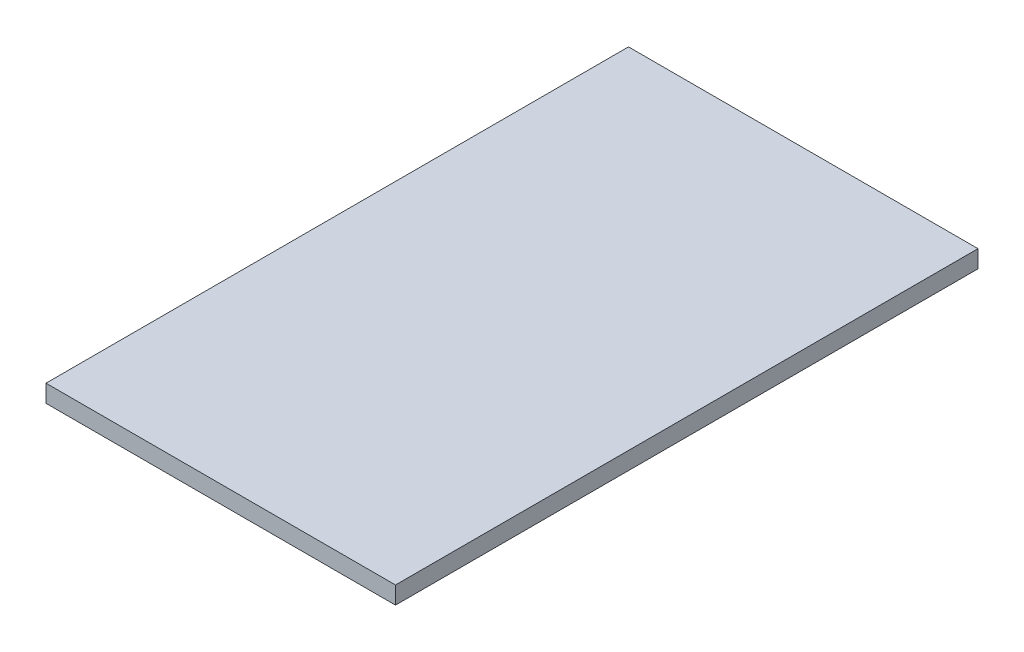
ISO-10303-21;
HEADER;
FILE_DESCRIPTION(('STEP AP214'),'2;1');
FILE_NAME('part.step','',(''),(''),'','','');
FILE_SCHEMA(('AUTOMOTIVE_DESIGN { 1 0 10303 214 1 1 1 1 }'));
ENDSEC;
DATA;
#1=APPLICATION_CONTEXT('core data for automotive mechanical design processes');
#2=APPLICATION_PROTOCOL_DEFINITION('international standard','automotive_design',2000,#1);
#3=PRODUCT_CONTEXT('',#1,'mechanical');
#4=PRODUCT('Part','Part','',(#3));
#5=PRODUCT_RELATED_PRODUCT_CATEGORY('part','',(#4));
#6=PRODUCT_DEFINITION_FORMATION('','',#4);
#7=PRODUCT_DEFINITION_CONTEXT('part definition',#1,'design');
#8=PRODUCT_DEFINITION('design','',#6,#7);
#9=PRODUCT_DEFINITION_SHAPE('','',#8);
#10=(LENGTH_UNIT() NAMED_UNIT(*) SI_UNIT(.MILLI.,.METRE.));
#11=(NAMED_UNIT(*) PLANE_ANGLE_UNIT() SI_UNIT($,.RADIAN.));
#12=(NAMED_UNIT(*) SI_UNIT($,.STERADIAN.) SOLID_ANGLE_UNIT());
#13=UNCERTAINTY_MEASURE_WITH_UNIT(LENGTH_MEASURE(1.E-05),#10,'distance_accuracy_value','');
#14=(GEOMETRIC_REPRESENTATION_CONTEXT(3) GLOBAL_UNCERTAINTY_ASSIGNED_CONTEXT((#13)) GLOBAL_UNIT_ASSIGNED_CONTEXT((#10,
#11,#12)) REPRESENTATION_CONTEXT('',''));
#15=CARTESIAN_POINT('',(0.,0.,0.));
#16=DIRECTION('',(0.,0.,1.));
#17=DIRECTION('',(1.,0.,0.));
#18=AXIS2_PLACEMENT_3D('',#15,#16,#17);
#19=CARTESIAN_POINT('',(300.,30.,-500.));
#20=DIRECTION('',(-1.,0.,0.));
#21=DIRECTION('',(0.,0.,1.));
#22=AXIS2_PLACEMENT_3D('',#19,#20,#21);
#23=PLANE('',#22);
#24=DIRECTION('',(0.,0.,-1.));
#25=VECTOR('',#24,1.);
#26=CARTESIAN_POINT('',(300.,0.,-500.));
#27=LINE('',#26,#25);
#28=CARTESIAN_POINT('',(300.,0.,500.));
#29=VERTEX_POINT('',#28);
#30=CARTESIAN_POINT('',(300.,0.,-500.));
#31=VERTEX_POINT('',#30);
#32=EDGE_CURVE('E107',#29,#31,#27,.T.);
#33=ORIENTED_EDGE('',*,*,#32,.T.);
#34=DIRECTION('',(0.,-1.,0.));
#35=VECTOR('',#34,1.);
#36=CARTESIAN_POINT('',(300.,30.,-500.));
#37=LINE('',#36,#35);
#38=CARTESIAN_POINT('',(300.,30.,-500.));
#39=VERTEX_POINT('',#38);
#40=EDGE_CURVE('E49',#39,#31,#37,.T.);
#41=ORIENTED_EDGE('',*,*,#40,.F.);
#42=DIRECTION('',(0.,0.,-1.));
#43=VECTOR('',#42,1.);
#44=CARTESIAN_POINT('',(300.,30.,-500.));
#45=LINE('',#44,#43);
#46=CARTESIAN_POINT('',(300.,30.,500.));
#47=VERTEX_POINT('',#46);
#48=EDGE_CURVE('E93',#47,#39,#45,.T.);
#49=ORIENTED_EDGE('',*,*,#48,.F.);
#50=DIRECTION('',(0.,-1.,0.));
#51=VECTOR('',#50,1.);
#52=CARTESIAN_POINT('',(300.,30.,500.));
#53=LINE('',#52,#51);
#54=EDGE_CURVE('E103',#47,#29,#53,.T.);
#55=ORIENTED_EDGE('',*,*,#54,.T.);
#56=EDGE_LOOP('',(#33,#41,#49,#55));
#57=FACE_BOUND('',#56,.T.);
#58=ADVANCED_FACE('F41',(#57),#23,.F.);
#59=CARTESIAN_POINT('',(-300.,30.,-500.));
#60=DIRECTION('',(0.,0.,1.));
#61=DIRECTION('',(1.,0.,0.));
#62=AXIS2_PLACEMENT_3D('',#59,#60,#61);
#63=PLANE('',#62);
#64=DIRECTION('',(-1.,0.,0.));
#65=VECTOR('',#64,1.);
#66=CARTESIAN_POINT('',(-300.,0.,-500.));
#67=LINE('',#66,#65);
#68=CARTESIAN_POINT('',(-300.,0.,-500.));
#69=VERTEX_POINT('',#68);
#70=EDGE_CURVE('E98',#31,#69,#67,.T.);
#71=ORIENTED_EDGE('',*,*,#70,.T.);
#72=DIRECTION('',(0.,-1.,0.));
#73=VECTOR('',#72,1.);
#74=CARTESIAN_POINT('',(-300.,30.,-500.));
#75=LINE('',#74,#73);
#76=CARTESIAN_POINT('',(-300.,30.,-500.));
#77=VERTEX_POINT('',#76);
#78=EDGE_CURVE('E96',#77,#69,#75,.T.);
#79=ORIENTED_EDGE('',*,*,#78,.F.);
#80=DIRECTION('',(-1.,0.,0.));
#81=VECTOR('',#80,1.);
#82=CARTESIAN_POINT('',(-300.,30.,-500.));
#83=LINE('',#82,#81);
#84=EDGE_CURVE('E88',#39,#77,#83,.T.);
#85=ORIENTED_EDGE('',*,*,#84,.F.);
#86=ORIENTED_EDGE('',*,*,#40,.T.);
#87=EDGE_LOOP('',(#71,#79,#85,#86));
#88=FACE_BOUND('',#87,.T.);
#89=ADVANCED_FACE('F97',(#88),#63,.F.);
#90=CARTESIAN_POINT('',(-300.,30.,-500.));
#91=DIRECTION('',(1.,0.,0.));
#92=DIRECTION('',(0.,0.,-1.));
#93=AXIS2_PLACEMENT_3D('',#90,#91,#92);
#94=PLANE('',#93);
#95=DIRECTION('',(0.,0.,1.));
#96=VECTOR('',#95,1.);
#97=CARTESIAN_POINT('',(-300.,0.,-500.));
#98=LINE('',#97,#96);
#99=CARTESIAN_POINT('',(-300.,0.,500.));
#100=VERTEX_POINT('',#99);
#101=EDGE_CURVE('E74',#69,#100,#98,.T.);
#102=ORIENTED_EDGE('',*,*,#101,.T.);
#103=DIRECTION('',(0.,-1.,0.));
#104=VECTOR('',#103,1.);
#105=CARTESIAN_POINT('',(-300.,30.,500.));
#106=LINE('',#105,#104);
#107=CARTESIAN_POINT('',(-300.,30.,500.));
#108=VERTEX_POINT('',#107);
#109=EDGE_CURVE('E99',#108,#100,#106,.T.);
#110=ORIENTED_EDGE('',*,*,#109,.F.);
#111=DIRECTION('',(0.,0.,1.));
#112=VECTOR('',#111,1.);
#113=CARTESIAN_POINT('',(-300.,30.,-500.));
#114=LINE('',#113,#112);
#115=EDGE_CURVE('E91',#77,#108,#114,.T.);
#116=ORIENTED_EDGE('',*,*,#115,.F.);
#117=ORIENTED_EDGE('',*,*,#78,.T.);
#118=EDGE_LOOP('',(#102,#110,#116,#117));
#119=FACE_BOUND('',#118,.T.);
#120=ADVANCED_FACE('F101',(#119),#94,.F.);
#121=CARTESIAN_POINT('',(-300.,30.,500.));
#122=DIRECTION('',(0.,0.,-1.));
#123=DIRECTION('',(-1.,0.,0.));
#124=AXIS2_PLACEMENT_3D('',#121,#122,#123);
#125=PLANE('',#124);
#126=DIRECTION('',(1.,0.,0.));
#127=VECTOR('',#126,1.);
#128=CARTESIAN_POINT('',(-300.,0.,500.));
#129=LINE('',#128,#127);
#130=EDGE_CURVE('E80',#100,#29,#129,.T.);
#131=ORIENTED_EDGE('',*,*,#130,.T.);
#132=ORIENTED_EDGE('',*,*,#54,.F.);
#133=DIRECTION('',(1.,0.,0.));
#134=VECTOR('',#133,1.);
#135=CARTESIAN_POINT('',(-300.,30.,500.));
#136=LINE('',#135,#134);
#137=EDGE_CURVE('E57',#108,#47,#136,.T.);
#138=ORIENTED_EDGE('',*,*,#137,.F.);
#139=ORIENTED_EDGE('',*,*,#109,.T.);
#140=EDGE_LOOP('',(#131,#132,#138,#139));
#141=FACE_BOUND('',#140,.T.);
#142=ADVANCED_FACE('F130',(#141),#125,.F.);
#143=CARTESIAN_POINT('',(0.,30.,0.));
#144=DIRECTION('',(0.,1.,0.));
#145=DIRECTION('',(0.,0.,1.));
#146=AXIS2_PLACEMENT_3D('',#143,#144,#145);
#147=PLANE('',#146);
#148=ORIENTED_EDGE('',*,*,#48,.T.);
#149=ORIENTED_EDGE('',*,*,#84,.T.);
#150=ORIENTED_EDGE('',*,*,#115,.T.);
#151=ORIENTED_EDGE('',*,*,#137,.T.);
#152=EDGE_LOOP('',(#148,#149,#150,#151));
#153=FACE_BOUND('',#152,.T.);
#154=ADVANCED_FACE('F89',(#153),#147,.T.);
#155=CARTESIAN_POINT('',(0.,0.,0.));
#156=DIRECTION('',(0.,1.,0.));
#157=DIRECTION('',(0.,0.,1.));
#158=AXIS2_PLACEMENT_3D('',#155,#156,#157);
#159=PLANE('',#158);
#160=CARTESIAN_POINT('',(0.,0.,0.));
#161=DIRECTION('',(0.,1.,0.));
#162=DIRECTION('',(0.,0.,1.));
#163=AXIS2_PLACEMENT_3D('',#160,#161,#162);
#164=CIRCLE('',#163,10.);
#165=CARTESIAN_POINT('',(0.,0.,10.));
#166=VERTEX_POINT('',#165);
#167=EDGE_CURVE('E11',#166,#166,#164,.F.);
#168=ORIENTED_EDGE('',*,*,#167,.F.);
#169=EDGE_LOOP('',(#168));
#170=FACE_BOUND('',#169,.T.);
#171=ORIENTED_EDGE('',*,*,#32,.F.);
#172=ORIENTED_EDGE('',*,*,#130,.F.);
#173=ORIENTED_EDGE('',*,*,#101,.F.);
#174=ORIENTED_EDGE('',*,*,#70,.F.);
#175=EDGE_LOOP('',(#171,#172,#173,#174));
#176=FACE_BOUND('',#175,.T.);
#177=ADVANCED_FACE('F118',(#170,#176),#159,.F.);
#178=CARTESIAN_POINT('',(0.,-10.,0.));
#179=DIRECTION('',(0.,1.,0.));
#180=DIRECTION('',(0.,0.,1.));
#181=AXIS2_PLACEMENT_3D('',#178,#179,#180);
#182=CYLINDRICAL_SURFACE('',#181,10.);
#183=CARTESIAN_POINT('',(0.,-10.,0.));
#184=DIRECTION('',(0.,-1.,0.));
#185=DIRECTION('',(0.,0.,-1.));
#186=AXIS2_PLACEMENT_3D('',#183,#184,#185);
#187=CIRCLE('',#186,10.);
#188=CARTESIAN_POINT('',(0.,-10.,-10.));
#189=VERTEX_POINT('',#188);
#190=EDGE_CURVE('E110',#189,#189,#187,.T.);
#191=ORIENTED_EDGE('',*,*,#190,.F.);
#192=EDGE_LOOP('',(#191));
#193=FACE_BOUND('',#192,.T.);
#194=ORIENTED_EDGE('',*,*,#167,.T.);
#195=EDGE_LOOP('',(#194));
#196=FACE_BOUND('',#195,.T.);
#197=ADVANCED_FACE('F120',(#193,#196),#182,.T.);
#198=CARTESIAN_POINT('',(0.,-10.,0.));
#199=DIRECTION('',(0.,-1.,0.));
#200=DIRECTION('',(0.,0.,-1.));
#201=AXIS2_PLACEMENT_3D('',#198,#199,#200);
#202=PLANE('',#201);
#203=ORIENTED_EDGE('',*,*,#190,.T.);
#204=EDGE_LOOP('',(#203));
#205=FACE_BOUND('',#204,.T.);
#206=ADVANCED_FACE('F127',(#205),#202,.T.);
#207=CLOSED_SHELL('',(#58,#89,#120,#142,#154,#177,#197,#206));
#208=MANIFOLD_SOLID_BREP('B2',#207);
#209=ADVANCED_BREP_SHAPE_REPRESENTATION('',(#18,#208),#14);
#210=SHAPE_DEFINITION_REPRESENTATION(#9,#209);
ENDSEC;
END-ISO-10303-21;
